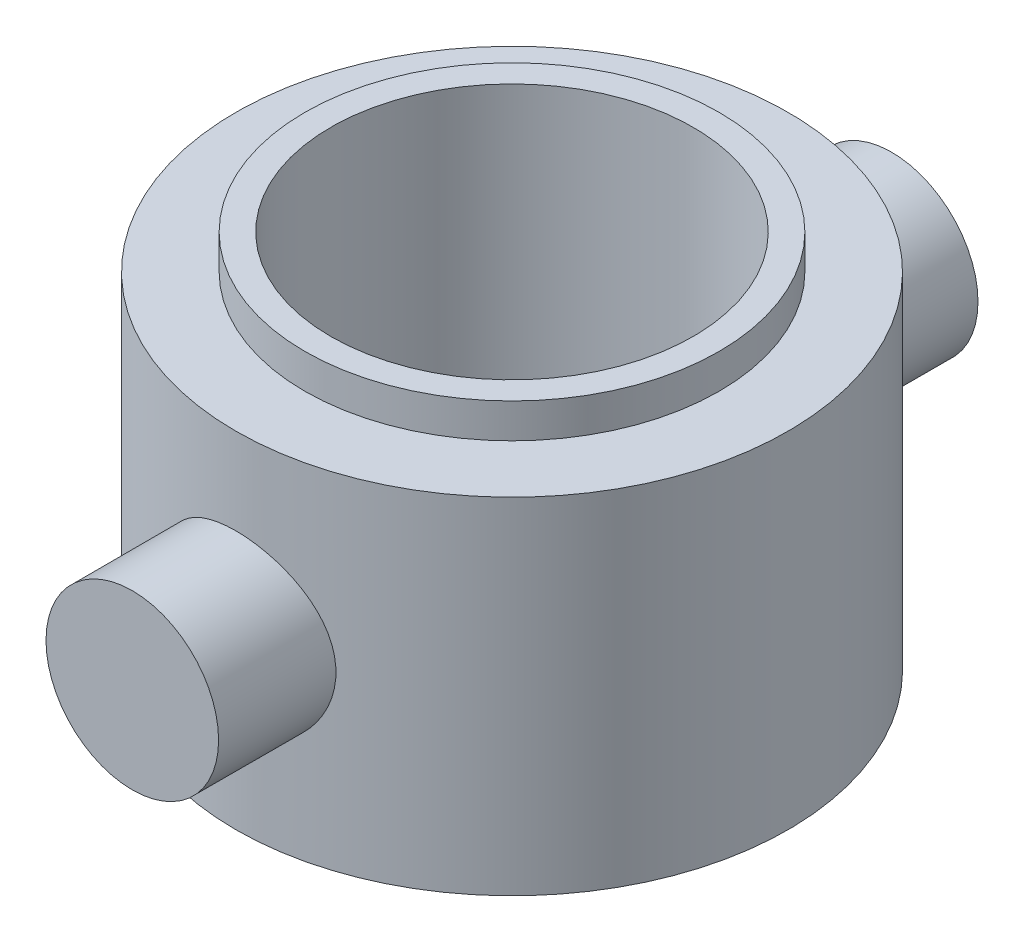
ISO-10303-21;
HEADER;
FILE_DESCRIPTION(('STEP AP214'),'2;1');
FILE_NAME('part.step','',(''),(''),'','','');
FILE_SCHEMA(('AUTOMOTIVE_DESIGN { 1 0 10303 214 1 1 1 1 }'));
ENDSEC;
DATA;
#1=APPLICATION_CONTEXT('core data for automotive mechanical design processes');
#2=APPLICATION_PROTOCOL_DEFINITION('international standard','automotive_design',2000,#1);
#3=PRODUCT_CONTEXT('',#1,'mechanical');
#4=PRODUCT('Part','Part','',(#3));
#5=PRODUCT_RELATED_PRODUCT_CATEGORY('part','',(#4));
#6=PRODUCT_DEFINITION_FORMATION('','',#4);
#7=PRODUCT_DEFINITION_CONTEXT('part definition',#1,'design');
#8=PRODUCT_DEFINITION('design','',#6,#7);
#9=PRODUCT_DEFINITION_SHAPE('','',#8);
#10=(LENGTH_UNIT() NAMED_UNIT(*) SI_UNIT(.MILLI.,.METRE.));
#11=(NAMED_UNIT(*) PLANE_ANGLE_UNIT() SI_UNIT($,.RADIAN.));
#12=(NAMED_UNIT(*) SI_UNIT($,.STERADIAN.) SOLID_ANGLE_UNIT());
#13=UNCERTAINTY_MEASURE_WITH_UNIT(LENGTH_MEASURE(1.E-05),#10,'distance_accuracy_value','');
#14=(GEOMETRIC_REPRESENTATION_CONTEXT(3) GLOBAL_UNCERTAINTY_ASSIGNED_CONTEXT((#13)) GLOBAL_UNIT_ASSIGNED_CONTEXT((#10,
#11,#12)) REPRESENTATION_CONTEXT('',''));
#15=CARTESIAN_POINT('',(0.,0.,0.));
#16=DIRECTION('',(0.,0.,1.));
#17=DIRECTION('',(1.,0.,0.));
#18=AXIS2_PLACEMENT_3D('',#15,#16,#17);
#19=CARTESIAN_POINT('',(0.,5.,0.));
#20=DIRECTION('',(0.,-1.,0.));
#21=DIRECTION('',(0.,0.,-1.));
#22=AXIS2_PLACEMENT_3D('',#19,#20,#21);
#23=CYLINDRICAL_SURFACE('',#22,8.);
#24=CARTESIAN_POINT('',(0.,2.5,-8.));
#25=CARTESIAN_POINT('',(-0.136878370349093,2.49999910682485,-7.9999993175598));
#26=CARTESIAN_POINT('',(-0.273766105005719,2.48872154611109,-7.99645389969682));
#27=CARTESIAN_POINT('',(-0.543538419176897,2.44402751692153,-7.98265788177613));
#28=CARTESIAN_POINT('',(-0.676422085451815,2.41060603727128,-7.97240576399719));
#29=CARTESIAN_POINT('',(-0.934257087301613,2.32286125760853,-7.94631631395819));
#30=CARTESIAN_POINT('',(-1.05922035397161,2.26857031069407,-7.9304876299805));
#31=CARTESIAN_POINT('',(-1.29826960469292,2.14076536464334,-7.89487938322185));
#32=CARTESIAN_POINT('',(-1.41235387088977,2.06724833643883,-7.8750991979981));
#33=CARTESIAN_POINT('',(-1.62993066990456,1.90068801596528,-7.83300427480565));
#34=CARTESIAN_POINT('',(-1.73304005631332,1.80715822987786,-7.81063431853978));
#35=CARTESIAN_POINT('',(-1.92239476407399,1.6042632151729,-7.76620092748417));
#36=CARTESIAN_POINT('',(-2.00863694579739,1.49489504501091,-7.74413755046914));
#37=CARTESIAN_POINT('',(-2.16388672966227,1.26011087238383,-7.70222289396344));
#38=CARTESIAN_POINT('',(-2.23241568300258,1.13436504494556,-7.68243976603591));
#39=CARTESIAN_POINT('',(-2.34719482153343,0.872415370036254,-7.64815603598469));
#40=CARTESIAN_POINT('',(-2.39345087543889,0.736214288412136,-7.63365404257377));
#41=CARTESIAN_POINT('',(-2.46096919860067,0.461543845095875,-7.61215213969001));
#42=CARTESIAN_POINT('',(-2.48294220015729,0.323266312722294,-7.60493945859016));
#43=CARTESIAN_POINT('',(-2.50349110073976,0.0448137621762125,-7.59820110281901));
#44=CARTESIAN_POINT('',(-2.50207321991544,-0.0953607416433236,-7.59867338454668));
#45=CARTESIAN_POINT('',(-2.47643649465479,-0.367748920537968,-7.60706378150876));
#46=CARTESIAN_POINT('',(-2.45312115738766,-0.50005825172313,-7.61468683491897));
#47=CARTESIAN_POINT('',(-2.38581626711252,-0.758784313074693,-7.63604051304978));
#48=CARTESIAN_POINT('',(-2.34182451689101,-0.885200415417601,-7.6497717868623));
#49=CARTESIAN_POINT('',(-2.23377749362554,-1.13070388886527,-7.68202088028593));
#50=CARTESIAN_POINT('',(-2.16943851324164,-1.24965722138397,-7.70060569321649));
#51=CARTESIAN_POINT('',(-2.02272041475696,-1.47537553575825,-7.7404371316014));
#52=CARTESIAN_POINT('',(-1.94033661043155,-1.58213734050743,-7.76168444789102));
#53=CARTESIAN_POINT('',(-1.75543390836425,-1.78554988683398,-7.80563055600986));
#54=CARTESIAN_POINT('',(-1.65216914118563,-1.88151911555937,-7.82835139211391));
#55=CARTESIAN_POINT('',(-1.43072881619106,-2.05494378715936,-7.8718314151916));
#56=CARTESIAN_POINT('',(-1.31255215469804,-2.13239785843842,-7.89259045676745));
#57=CARTESIAN_POINT('',(-1.06332922093091,-2.26705537720255,-7.93002589780382));
#58=CARTESIAN_POINT('',(-0.932189813838559,-2.32409627092794,-7.94666921296415));
#59=CARTESIAN_POINT('',(-0.661535955565288,-2.41510600170313,-7.97375911657108));
#60=CARTESIAN_POINT('',(-0.522024061449216,-2.44908184447679,-7.98420758650304));
#61=CARTESIAN_POINT('',(-0.244370314580689,-2.49183608515796,-7.99742778790027));
#62=CARTESIAN_POINT('',(-0.106383697577686,-2.50153708718705,-8.00048045790873));
#63=CARTESIAN_POINT('',(0.169260611465172,-2.49806754672534,-7.99939599461967));
#64=CARTESIAN_POINT('',(0.306918348613018,-2.48490034535478,-7.9952599116227));
#65=CARTESIAN_POINT('',(0.574438665951698,-2.43680881478723,-7.98044727539523));
#66=CARTESIAN_POINT('',(0.704409956841874,-2.40243346477503,-7.96993586221374));
#67=CARTESIAN_POINT('',(0.956703857722754,-2.31357129526657,-7.94360242758579));
#68=CARTESIAN_POINT('',(1.07902552089812,-2.25908199194998,-7.92777975028687));
#69=CARTESIAN_POINT('',(1.31586481334438,-2.13005356690263,-7.89197085518848));
#70=CARTESIAN_POINT('',(1.43011947957558,-2.05505802500638,-7.87189253635335));
#71=CARTESIAN_POINT('',(1.64473170192052,-1.88769357976515,-7.82986820006859));
#72=CARTESIAN_POINT('',(1.7450854760879,-1.79531996451072,-7.80792167695774));
#73=CARTESIAN_POINT('',(1.93317492583804,-1.5914822198958,-7.76353989766283));
#74=CARTESIAN_POINT('',(2.02025304679062,-1.47940667252155,-7.74111973412883));
#75=CARTESIAN_POINT('',(2.17442500490303,-1.24174676724645,-7.69923894191212));
#76=CARTESIAN_POINT('',(2.24151915946859,-1.11616262394603,-7.67977826622621));
#77=CARTESIAN_POINT('',(2.35340166961085,-0.855309654259046,-7.64623564661738));
#78=CARTESIAN_POINT('',(2.39827639112025,-0.720080701128556,-7.63213292713749));
#79=CARTESIAN_POINT('',(2.4644578863618,-0.44345501350276,-7.6110234168862));
#80=CARTESIAN_POINT('',(2.48577362827989,-0.302060647312934,-7.60401392602456));
#81=CARTESIAN_POINT('',(2.50358812316251,-0.0239918248391436,-7.59816585427753));
#82=CARTESIAN_POINT('',(2.50116559243271,0.112606907694837,-7.59897209200284));
#83=CARTESIAN_POINT('',(2.47417636257668,0.383349169883877,-7.60780180751807));
#84=CARTESIAN_POINT('',(2.44961069645024,0.517492813773472,-7.61582494863208));
#85=CARTESIAN_POINT('',(2.37975459827235,0.777588079183785,-7.6379362836678));
#86=CARTESIAN_POINT('',(2.33477284812016,0.903630882186722,-7.65193396380513));
#87=CARTESIAN_POINT('',(2.22560454669999,1.14648082706801,-7.68439408509128));
#88=CARTESIAN_POINT('',(2.16141408888474,1.26328608415681,-7.70285743429343));
#89=CARTESIAN_POINT('',(2.01271350026986,1.48929194087963,-7.74306974067005));
#90=CARTESIAN_POINT('',(1.92750667048265,1.59801625900048,-7.76491897845913));
#91=CARTESIAN_POINT('',(1.7404179928096,1.799972656224,-7.8089799764242));
#92=CARTESIAN_POINT('',(1.63853168468878,1.89320057798212,-7.83119183213309));
#93=CARTESIAN_POINT('',(1.41697332564669,2.06456507672586,-7.87434543904947));
#94=CARTESIAN_POINT('',(1.29682914897477,2.1421094728999,-7.89522203461345));
#95=CARTESIAN_POINT('',(1.0445582760273,2.27579783027891,-7.93253538593756));
#96=CARTESIAN_POINT('',(0.912436315590895,2.33195020428367,-7.94897388631644));
#97=CARTESIAN_POINT('',(0.651495270747955,2.41718273521693,-7.97441301466941));
#98=CARTESIAN_POINT('',(0.52334067422509,2.44814973461067,-7.98392481612283));
#99=CARTESIAN_POINT('',(0.263459790880494,2.48955671993543,-7.99671800680967));
#100=CARTESIAN_POINT('',(0.131734232279349,2.50000085960801,-8.00000065679286));
#101=CARTESIAN_POINT('',(0.,2.5,-8.));
#102=B_SPLINE_CURVE_WITH_KNOTS('',3,(#24,#25,#26,#27,#28,#29,#30,#31,#32,#33,#34,#35,#36,#37,
#38,#39,#40,#41,#42,#43,#44,#45,#46,#47,#48,#49,#50,#51,#52,#53,#54,#55,#56,#57,#58,#59,#60,#61,
#62,#63,#64,#65,#66,#67,#68,#69,#70,#71,#72,#73,#74,#75,#76,#77,#78,#79,#80,#81,#82,#83,#84,#85,
#86,#87,#88,#89,#90,#91,#92,#93,#94,#95,#96,#97,#98,#99,#100,#101),.UNSPECIFIED.,.T.,.F.,(4,2,2,
2,2,2,2,2,2,2,2,2,2,2,2,2,2,2,2,2,2,2,2,2,2,2,2,2,2,2,2,2,2,2,2,2,2,2,4),(0.,0.41015089886502,
0.820394646698133,1.23000495840487,1.63967984311678,2.06075644390317,2.48191134862552,
2.91347542494988,3.34492572559054,3.7633830033442,4.18172900590277,4.58353834844338,
4.98539039958126,5.39311285441091,5.80094132020717,6.227334945592,6.65376014826606,
7.0835092137954,7.51312768989108,7.92615137096475,8.33911471298726,8.74181253445744,
9.14456010069,9.55712649476687,9.96980491418519,10.3988355742628,10.8278594196742,
11.2552023150671,11.6823824779468,12.0902440696666,12.4980866352126,12.8999582681244,
13.3019116867944,13.7195902803182,14.1373807476578,14.5688133627192,15.0000761335177,
15.3948927332218,15.7896294154519),.UNSPECIFIED.);
#103=CARTESIAN_POINT('',(0.,2.5,-8.));
#104=VERTEX_POINT('',#103);
#105=EDGE_CURVE('E41',#104,#104,#102,.T.);
#106=ORIENTED_EDGE('',*,*,#105,.T.);
#107=EDGE_LOOP('',(#106));
#108=FACE_BOUND('',#107,.T.);
#109=CARTESIAN_POINT('',(0.,5.,0.));
#110=DIRECTION('',(0.,1.,0.));
#111=DIRECTION('',(0.,0.,1.));
#112=AXIS2_PLACEMENT_3D('',#109,#110,#111);
#113=CIRCLE('',#112,8.);
#114=CARTESIAN_POINT('',(0.,5.,8.));
#115=VERTEX_POINT('',#114);
#116=EDGE_CURVE('E50',#115,#115,#113,.T.);
#117=ORIENTED_EDGE('',*,*,#116,.F.);
#118=EDGE_LOOP('',(#117));
#119=FACE_BOUND('',#118,.T.);
#120=CARTESIAN_POINT('',(0.,-5.,0.));
#121=DIRECTION('',(0.,1.,0.));
#122=DIRECTION('',(0.,0.,1.));
#123=AXIS2_PLACEMENT_3D('',#120,#121,#122);
#124=CIRCLE('',#123,8.);
#125=CARTESIAN_POINT('',(0.,-5.,8.));
#126=VERTEX_POINT('',#125);
#127=EDGE_CURVE('E55',#126,#126,#124,.T.);
#128=ORIENTED_EDGE('',*,*,#127,.T.);
#129=EDGE_LOOP('',(#128));
#130=FACE_BOUND('',#129,.T.);
#131=CARTESIAN_POINT('',(-2.5,0.,7.59934207678533));
#132=CARTESIAN_POINT('',(-2.49999907560094,-0.136694072218673,7.59934291923872));
#133=CARTESIAN_POINT('',(-2.48875077582989,-0.2733975374064,7.60307063010085));
#134=CARTESIAN_POINT('',(-2.44418350802654,-0.542788321755614,7.61751277997754));
#135=CARTESIAN_POINT('',(-2.4108585756503,-0.675474545464322,7.62822910706272));
#136=CARTESIAN_POINT('',(-2.32339576447118,-0.932889803864001,7.65531877671919));
#137=CARTESIAN_POINT('',(-2.26929471473354,-1.05763246621136,7.67168210388633));
#138=CARTESIAN_POINT('',(-2.14193828346314,-1.29630539172803,7.70820812437377));
#139=CARTESIAN_POINT('',(-2.06867951811264,-1.41023373992025,7.72837148871681));
#140=CARTESIAN_POINT('',(-1.90239214124458,-1.62795773498697,7.7710025533724));
#141=CARTESIAN_POINT('',(-1.8088187994408,-1.73132721887197,7.79352246769561));
#142=CARTESIAN_POINT('',(-1.60572409291099,-1.92119202641837,7.83788491720671));
#143=CARTESIAN_POINT('',(-1.49620050503713,-2.00768499388969,7.85972735745255));
#144=CARTESIAN_POINT('',(-1.26125182498672,-2.16322212602249,7.90087106780156));
#145=CARTESIAN_POINT('',(-1.13552311304019,-2.23182740766291,7.9201036912556));
#146=CARTESIAN_POINT('',(-0.873608465706807,-2.3467520997111,7.95325103666038));
#147=CARTESIAN_POINT('',(-0.737424996974103,-2.39307674829917,7.9671670083984));
#148=CARTESIAN_POINT('',(-0.462928713932196,-2.46070225619414,7.98774351641724));
#149=CARTESIAN_POINT('',(-0.324811430936432,-2.4827314995757,7.99461477968283));
#150=CARTESIAN_POINT('',(-0.0466816279690392,-2.50344869287505,8.00107191752033));
#151=CARTESIAN_POINT('',(0.0933304539461728,-2.50214194871765,8.00065944820141));
#152=CARTESIAN_POINT('',(0.366148960709463,-2.47670341682812,7.99274232265063));
#153=CARTESIAN_POINT('',(0.499037268628066,-2.453361232974,7.98548301944274));
#154=CARTESIAN_POINT('',(0.758906126695562,-2.38581001991396,7.9649896512175));
#155=CARTESIAN_POINT('',(0.885886290962472,-2.34159962982675,7.95175519654419));
#156=CARTESIAN_POINT('',(1.13215620630948,-2.23305962185038,7.92046919458913));
#157=CARTESIAN_POINT('',(1.25133281124536,-2.16849038287449,7.90236067233341));
#158=CARTESIAN_POINT('',(1.47740502230436,-2.02125780059032,7.86323445907697));
#159=CARTESIAN_POINT('',(1.58429751241882,-1.93858988172226,7.84221603291309));
#160=CARTESIAN_POINT('',(1.78747539690657,-1.75345273039957,7.79847341467063));
#161=CARTESIAN_POINT('',(1.88313309818382,-1.65030186232582,7.77571463969686));
#162=CARTESIAN_POINT('',(2.05597948519529,-1.42920979634286,7.73181230889308));
#163=CARTESIAN_POINT('',(2.13316599552377,-1.31126685881929,7.71066894351396));
#164=CARTESIAN_POINT('',(2.26760930038169,-1.06216506230485,7.6722169326579));
#165=CARTESIAN_POINT('',(2.32463361399527,-0.930873182018058,7.65495380588194));
#166=CARTESIAN_POINT('',(2.41556691891091,-0.659881016315987,7.62675090557699));
#167=CARTESIAN_POINT('',(2.44948421530003,-0.52018377161125,7.61580886035023));
#168=CARTESIAN_POINT('',(2.4920297037281,-0.242360094845721,7.60199126814082));
#169=CARTESIAN_POINT('',(2.50161908707794,-0.104396007529735,7.59880932787513));
#170=CARTESIAN_POINT('',(2.49793488996242,0.171179482990276,7.6000215491985));
#171=CARTESIAN_POINT('',(2.48466484222813,0.308790937399332,7.60441454014633));
#172=CARTESIAN_POINT('',(2.43649747026382,0.575616593304846,7.61997914967833));
#173=CARTESIAN_POINT('',(2.40223662321101,0.704958548148402,7.63095108204023));
#174=CARTESIAN_POINT('',(2.31380747322029,0.956043583991669,7.65822574662762));
#175=CARTESIAN_POINT('',(2.25963592342302,1.07778542184227,7.67452934824624));
#176=CARTESIAN_POINT('',(2.13115021311757,1.31407821954362,7.71121079306468));
#177=CARTESIAN_POINT('',(2.05630294977117,1.42832283118558,7.73169206979509));
#178=CARTESIAN_POINT('',(1.8892128173596,1.6429806927238,7.77420697945615));
#179=CARTESIAN_POINT('',(1.79696542938156,1.74339033785067,7.79624101471394));
#180=CARTESIAN_POINT('',(1.59314589550721,1.93182073182564,7.84048375125371));
#181=CARTESIAN_POINT('',(1.48093129957704,2.01915557227973,7.86266184571362));
#182=CARTESIAN_POINT('',(1.24290309130279,2.17378208664251,7.90378119687353));
#183=CARTESIAN_POINT('',(1.11709010221725,2.24107467862207,7.92272260181891));
#184=CARTESIAN_POINT('',(0.856211046663664,2.35306112494336,7.95512623857025));
#185=CARTESIAN_POINT('',(0.721220368567512,2.39791857568736,7.968627991224));
#186=CARTESIAN_POINT('',(0.44511450811278,2.46414507717941,7.98880485297152));
#187=CARTESIAN_POINT('',(0.304001256680714,2.48552147816699,7.99548209828555));
#188=CARTESIAN_POINT('',(0.0259698732977986,2.50358200349924,8.00111606808923));
#189=CARTESIAN_POINT('',(-0.110878383893044,2.50125690034152,8.0003825881478));
#190=CARTESIAN_POINT('',(-0.382146443846495,2.47437637790261,7.99201956162097));
#191=CARTESIAN_POINT('',(-0.516566404359136,2.4498224080161,7.98439046465238));
#192=CARTESIAN_POINT('',(-0.777510236961582,2.37981198155545,7.96319141689591));
#193=CARTESIAN_POINT('',(-0.904111836898961,2.33462078430926,7.9496969592041));
#194=CARTESIAN_POINT('',(-1.14799685100018,2.22485834558305,7.918158911759));
#195=CARTESIAN_POINT('',(-1.26527866254896,2.16028378005314,7.90011454182716));
#196=CARTESIAN_POINT('',(-1.49152338993938,2.01105448331112,7.86059793766752));
#197=CARTESIAN_POINT('',(-1.60006921410622,1.92579295507206,7.83903019501924));
#198=CARTESIAN_POINT('',(-1.80164158279864,1.73868022111307,7.79517473094122));
#199=CARTESIAN_POINT('',(-1.89466346700832,1.63682405172123,7.77288679569653));
#200=CARTESIAN_POINT('',(-2.06565731822505,1.4153685603178,7.72923785154876));
#201=CARTESIAN_POINT('',(-2.14302855989422,1.29529319376685,7.70793201726912));
#202=CARTESIAN_POINT('',(-2.27640941497043,1.04320375946172,7.66960250559062));
#203=CARTESIAN_POINT('',(-2.33242766807092,0.911194547099499,7.65257709722773));
#204=CARTESIAN_POINT('',(-2.41742360871585,0.65055476537066,7.62613120880655));
#205=CARTESIAN_POINT('',(-2.44829879675747,0.522594905096871,7.61618630087498));
#206=CARTESIAN_POINT('',(-2.48958491632199,0.263092335807021,7.60279212964797));
#207=CARTESIAN_POINT('',(-2.50000088961557,0.131550517597004,7.59934126603196));
#208=CARTESIAN_POINT('',(-2.5,0.,7.59934207678533));
#209=B_SPLINE_CURVE_WITH_KNOTS('',3,(#131,#132,#133,#134,#135,#136,#137,#138,#139,#140,#141,
#142,#143,#144,#145,#146,#147,#148,#149,#150,#151,#152,#153,#154,#155,#156,#157,#158,#159,#160,
#161,#162,#163,#164,#165,#166,#167,#168,#169,#170,#171,#172,#173,#174,#175,#176,#177,#178,#179,
#180,#181,#182,#183,#184,#185,#186,#187,#188,#189,#190,#191,#192,#193,#194,#195,#196,#197,#198,
#199,#200,#201,#202,#203,#204,#205,#206,#207,#208),.UNSPECIFIED.,.T.,.F.,(4,2,2,2,2,2,2,2,2,2,2,
2,2,2,2,2,2,2,2,2,2,2,2,2,2,2,2,2,2,2,2,2,2,2,2,2,2,2,4),(0.,0.40959627509698,0.819303254119471,
1.22828728823716,1.6373436098499,2.05914161101677,2.48099845882246,2.91239643927466,
3.34369294835844,3.76167445671067,4.17956092943549,4.58301965939501,4.98650470380186,
5.39492809216818,5.80345485426375,6.22900677874668,6.65460879707552,7.08496941871144,
7.51517527910369,7.92809866580735,8.34095824443043,8.7418794409359,9.14286604511284,
9.55535226624085,9.96794576028624,10.3976387562789,10.8273120663904,11.2538047858686,
11.6801639628603,12.0887760488391,12.4973614938948,12.9008369303438,13.3043815982817,
13.7216138621529,14.1389711554925,14.5701559100827,15.0011660161251,15.3954470874764,
15.7896309838242),.UNSPECIFIED.);
#210=CARTESIAN_POINT('',(-2.5,0.,7.59934207678533));
#211=VERTEX_POINT('',#210);
#212=EDGE_CURVE('E10',#211,#211,#209,.T.);
#213=ORIENTED_EDGE('',*,*,#212,.F.);
#214=EDGE_LOOP('',(#213));
#215=FACE_BOUND('',#214,.T.);
#216=ADVANCED_FACE('F37',(#108,#119,#130,#215),#23,.T.);
#217=CARTESIAN_POINT('',(0.,5.,0.));
#218=DIRECTION('',(0.,1.,0.));
#219=DIRECTION('',(0.,0.,1.));
#220=AXIS2_PLACEMENT_3D('',#217,#218,#219);
#221=PLANE('',#220);
#222=ORIENTED_EDGE('',*,*,#116,.T.);
#223=EDGE_LOOP('',(#222));
#224=FACE_BOUND('',#223,.T.);
#225=CARTESIAN_POINT('',(0.,5.,0.));
#226=DIRECTION('',(0.,1.,0.));
#227=DIRECTION('',(0.,0.,1.));
#228=AXIS2_PLACEMENT_3D('',#225,#226,#227);
#229=CIRCLE('',#228,6.);
#230=CARTESIAN_POINT('',(0.,5.,6.));
#231=VERTEX_POINT('',#230);
#232=EDGE_CURVE('E62',#231,#231,#229,.F.);
#233=ORIENTED_EDGE('',*,*,#232,.T.);
#234=EDGE_LOOP('',(#233));
#235=FACE_BOUND('',#234,.T.);
#236=ADVANCED_FACE('F84',(#224,#235),#221,.T.);
#237=CARTESIAN_POINT('',(0.,-5.,0.));
#238=DIRECTION('',(0.,1.,0.));
#239=DIRECTION('',(0.,0.,1.));
#240=AXIS2_PLACEMENT_3D('',#237,#238,#239);
#241=PLANE('',#240);
#242=ORIENTED_EDGE('',*,*,#127,.F.);
#243=EDGE_LOOP('',(#242));
#244=FACE_BOUND('',#243,.T.);
#245=CARTESIAN_POINT('',(0.,-5.,0.));
#246=DIRECTION('',(0.,1.,0.));
#247=DIRECTION('',(0.,0.,1.));
#248=AXIS2_PLACEMENT_3D('',#245,#246,#247);
#249=CIRCLE('',#248,5.25);
#250=CARTESIAN_POINT('',(0.,-5.,5.25));
#251=VERTEX_POINT('',#250);
#252=EDGE_CURVE('E107',#251,#251,#249,.T.);
#253=ORIENTED_EDGE('',*,*,#252,.T.);
#254=EDGE_LOOP('',(#253));
#255=FACE_BOUND('',#254,.T.);
#256=ADVANCED_FACE('F82',(#244,#255),#241,.F.);
#257=CARTESIAN_POINT('',(0.,5.,0.));
#258=DIRECTION('',(0.,-1.,0.));
#259=DIRECTION('',(0.,0.,-1.));
#260=AXIS2_PLACEMENT_3D('',#257,#258,#259);
#261=CYLINDRICAL_SURFACE('',#260,5.25);
#262=ORIENTED_EDGE('',*,*,#252,.F.);
#263=EDGE_LOOP('',(#262));
#264=FACE_BOUND('',#263,.T.);
#265=CARTESIAN_POINT('',(0.,6.,0.));
#266=DIRECTION('',(0.,1.,0.));
#267=DIRECTION('',(0.,0.,1.));
#268=AXIS2_PLACEMENT_3D('',#265,#266,#267);
#269=CIRCLE('',#268,5.25);
#270=CARTESIAN_POINT('',(0.,6.,5.25));
#271=VERTEX_POINT('',#270);
#272=EDGE_CURVE('E116',#271,#271,#269,.T.);
#273=ORIENTED_EDGE('',*,*,#272,.T.);
#274=EDGE_LOOP('',(#273));
#275=FACE_BOUND('',#274,.T.);
#276=ADVANCED_FACE('F75',(#264,#275),#261,.F.);
#277=CARTESIAN_POINT('',(0.,6.,0.));
#278=DIRECTION('',(0.,1.,0.));
#279=DIRECTION('',(0.,0.,1.));
#280=AXIS2_PLACEMENT_3D('',#277,#278,#279);
#281=PLANE('',#280);
#282=CARTESIAN_POINT('',(0.,6.,0.));
#283=DIRECTION('',(0.,1.,0.));
#284=DIRECTION('',(0.,0.,1.));
#285=AXIS2_PLACEMENT_3D('',#282,#283,#284);
#286=CIRCLE('',#285,6.);
#287=CARTESIAN_POINT('',(0.,6.,6.));
#288=VERTEX_POINT('',#287);
#289=EDGE_CURVE('E112',#288,#288,#286,.T.);
#290=ORIENTED_EDGE('',*,*,#289,.T.);
#291=EDGE_LOOP('',(#290));
#292=FACE_BOUND('',#291,.T.);
#293=ORIENTED_EDGE('',*,*,#272,.F.);
#294=EDGE_LOOP('',(#293));
#295=FACE_BOUND('',#294,.T.);
#296=ADVANCED_FACE('F72',(#292,#295),#281,.T.);
#297=CARTESIAN_POINT('',(0.,6.,0.));
#298=DIRECTION('',(0.,-1.,0.));
#299=DIRECTION('',(0.,0.,-1.));
#300=AXIS2_PLACEMENT_3D('',#297,#298,#299);
#301=CYLINDRICAL_SURFACE('',#300,6.);
#302=ORIENTED_EDGE('',*,*,#232,.F.);
#303=EDGE_LOOP('',(#302));
#304=FACE_BOUND('',#303,.T.);
#305=ORIENTED_EDGE('',*,*,#289,.F.);
#306=EDGE_LOOP('',(#305));
#307=FACE_BOUND('',#306,.T.);
#308=ADVANCED_FACE('F70',(#304,#307),#301,.T.);
#309=CARTESIAN_POINT('',(0.,0.,11.));
#310=DIRECTION('',(0.,0.,-1.));
#311=DIRECTION('',(-1.,0.,0.));
#312=AXIS2_PLACEMENT_3D('',#309,#310,#311);
#313=CYLINDRICAL_SURFACE('',#312,2.5);
#314=CARTESIAN_POINT('',(0.,0.,11.));
#315=DIRECTION('',(0.,0.,1.));
#316=DIRECTION('',(1.,0.,0.));
#317=AXIS2_PLACEMENT_3D('',#314,#315,#316);
#318=CIRCLE('',#317,2.5);
#319=CARTESIAN_POINT('',(2.5,0.,11.));
#320=VERTEX_POINT('',#319);
#321=EDGE_CURVE('E120',#320,#320,#318,.T.);
#322=ORIENTED_EDGE('',*,*,#321,.F.);
#323=EDGE_LOOP('',(#322));
#324=FACE_BOUND('',#323,.T.);
#325=ORIENTED_EDGE('',*,*,#212,.T.);
#326=EDGE_LOOP('',(#325));
#327=FACE_BOUND('',#326,.T.);
#328=ADVANCED_FACE('F64',(#324,#327),#313,.T.);
#329=CARTESIAN_POINT('',(0.,0.,11.));
#330=DIRECTION('',(0.,0.,1.));
#331=DIRECTION('',(1.,0.,0.));
#332=AXIS2_PLACEMENT_3D('',#329,#330,#331);
#333=PLANE('',#332);
#334=ORIENTED_EDGE('',*,*,#321,.T.);
#335=EDGE_LOOP('',(#334));
#336=FACE_BOUND('',#335,.T.);
#337=ADVANCED_FACE('F69',(#336),#333,.T.);
#338=CARTESIAN_POINT('',(0.,0.,-11.));
#339=DIRECTION('',(0.,0.,1.));
#340=DIRECTION('',(1.,0.,0.));
#341=AXIS2_PLACEMENT_3D('',#338,#339,#340);
#342=CYLINDRICAL_SURFACE('',#341,2.5);
#343=CARTESIAN_POINT('',(0.,0.,-11.));
#344=DIRECTION('',(0.,0.,1.));
#345=DIRECTION('',(1.,0.,0.));
#346=AXIS2_PLACEMENT_3D('',#343,#344,#345);
#347=CIRCLE('',#346,2.5);
#348=CARTESIAN_POINT('',(2.5,0.,-11.));
#349=VERTEX_POINT('',#348);
#350=EDGE_CURVE('E124',#349,#349,#347,.T.);
#351=ORIENTED_EDGE('',*,*,#350,.T.);
#352=EDGE_LOOP('',(#351));
#353=FACE_BOUND('',#352,.T.);
#354=ORIENTED_EDGE('',*,*,#105,.F.);
#355=EDGE_LOOP('',(#354));
#356=FACE_BOUND('',#355,.T.);
#357=ADVANCED_FACE('F139',(#353,#356),#342,.T.);
#358=CARTESIAN_POINT('',(0.,0.,-11.));
#359=DIRECTION('',(0.,0.,-1.));
#360=DIRECTION('',(1.,0.,0.));
#361=AXIS2_PLACEMENT_3D('',#358,#359,#360);
#362=PLANE('',#361);
#363=ORIENTED_EDGE('',*,*,#350,.F.);
#364=EDGE_LOOP('',(#363));
#365=FACE_BOUND('',#364,.T.);
#366=ADVANCED_FACE('F142',(#365),#362,.T.);
#367=CLOSED_SHELL('',(#216,#236,#256,#276,#296,#308,#328,#337,#357,#366));
#368=MANIFOLD_SOLID_BREP('B2',#367);
#369=ADVANCED_BREP_SHAPE_REPRESENTATION('',(#18,#368),#14);
#370=SHAPE_DEFINITION_REPRESENTATION(#9,#369);
ENDSEC;
END-ISO-10303-21;
